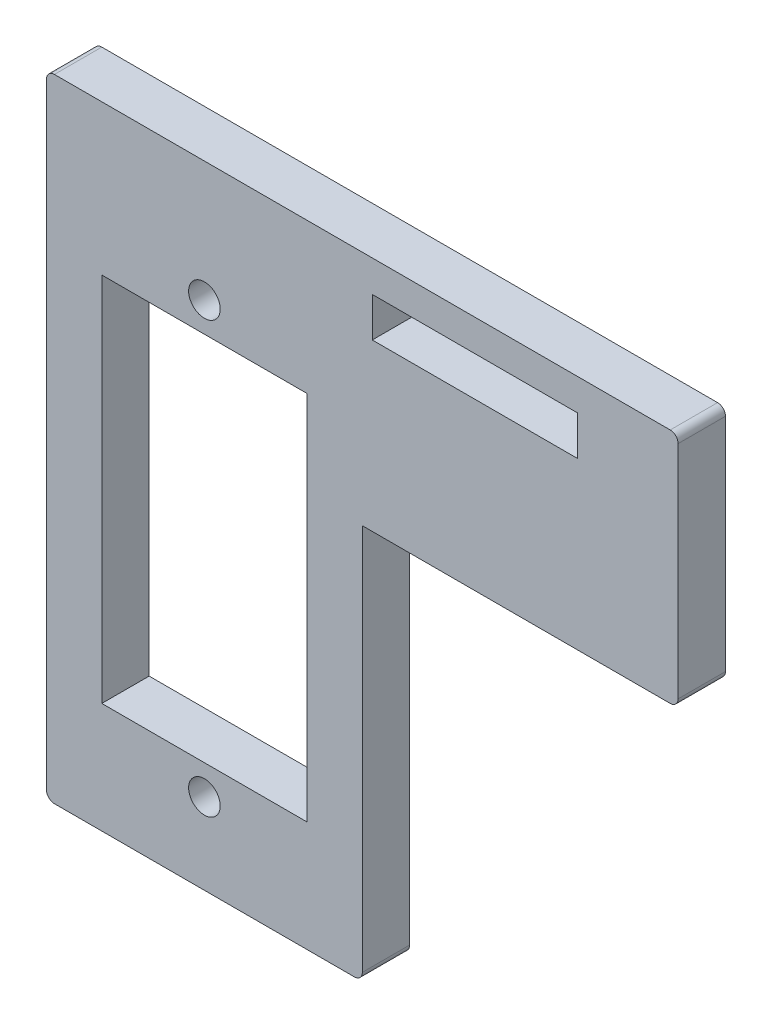
ISO-10303-21;
HEADER;
FILE_DESCRIPTION(('STEP AP214'),'2;1');
FILE_NAME('part.step','',(''),(''),'','','');
FILE_SCHEMA(('AUTOMOTIVE_DESIGN { 1 0 10303 214 1 1 1 1 }'));
ENDSEC;
DATA;
#1=APPLICATION_CONTEXT('core data for automotive mechanical design processes');
#2=APPLICATION_PROTOCOL_DEFINITION('international standard','automotive_design',2000,#1);
#3=PRODUCT_CONTEXT('',#1,'mechanical');
#4=PRODUCT('Part','Part','',(#3));
#5=PRODUCT_RELATED_PRODUCT_CATEGORY('part','',(#4));
#6=PRODUCT_DEFINITION_FORMATION('','',#4);
#7=PRODUCT_DEFINITION_CONTEXT('part definition',#1,'design');
#8=PRODUCT_DEFINITION('design','',#6,#7);
#9=PRODUCT_DEFINITION_SHAPE('','',#8);
#10=(LENGTH_UNIT() NAMED_UNIT(*) SI_UNIT(.MILLI.,.METRE.));
#11=(NAMED_UNIT(*) PLANE_ANGLE_UNIT() SI_UNIT($,.RADIAN.));
#12=(NAMED_UNIT(*) SI_UNIT($,.STERADIAN.) SOLID_ANGLE_UNIT());
#13=UNCERTAINTY_MEASURE_WITH_UNIT(LENGTH_MEASURE(1.E-05),#10,'distance_accuracy_value','');
#14=(GEOMETRIC_REPRESENTATION_CONTEXT(3) GLOBAL_UNCERTAINTY_ASSIGNED_CONTEXT((#13)) GLOBAL_UNIT_ASSIGNED_CONTEXT((#10,
#11,#12)) REPRESENTATION_CONTEXT('',''));
#15=CARTESIAN_POINT('',(0.,0.,0.));
#16=DIRECTION('',(0.,0.,1.));
#17=DIRECTION('',(1.,0.,0.));
#18=AXIS2_PLACEMENT_3D('',#15,#16,#17);
#19=CARTESIAN_POINT('',(0.,0.,3.));
#20=DIRECTION('',(0.,0.,1.));
#21=DIRECTION('',(1.,0.,0.));
#22=AXIS2_PLACEMENT_3D('',#19,#20,#21);
#23=PLANE('',#22);
#24=DIRECTION('',(0.,-1.,0.));
#25=VECTOR('',#24,1.);
#26=CARTESIAN_POINT('',(23.6302282117293,19.25,3.));
#27=LINE('',#26,#25);
#28=CARTESIAN_POINT('',(23.6302282117293,19.25,3.));
#29=VERTEX_POINT('',#28);
#30=CARTESIAN_POINT('',(23.6302282117293,16.75,3.));
#31=VERTEX_POINT('',#30);
#32=EDGE_CURVE('E173',#29,#31,#27,.T.);
#33=ORIENTED_EDGE('',*,*,#32,.T.);
#34=DIRECTION('',(-1.,0.,0.));
#35=VECTOR('',#34,1.);
#36=CARTESIAN_POINT('',(23.6302282117293,16.75,3.));
#37=LINE('',#36,#35);
#38=CARTESIAN_POINT('',(10.6302282117293,16.75,3.));
#39=VERTEX_POINT('',#38);
#40=EDGE_CURVE('E162',#31,#39,#37,.T.);
#41=ORIENTED_EDGE('',*,*,#40,.T.);
#42=DIRECTION('',(0.,1.,0.));
#43=VECTOR('',#42,1.);
#44=CARTESIAN_POINT('',(10.6302282117293,19.25,3.));
#45=LINE('',#44,#43);
#46=CARTESIAN_POINT('',(10.6302282117293,19.25,3.));
#47=VERTEX_POINT('',#46);
#48=EDGE_CURVE('E183',#39,#47,#45,.T.);
#49=ORIENTED_EDGE('',*,*,#48,.T.);
#50=DIRECTION('',(1.,0.,0.));
#51=VECTOR('',#50,1.);
#52=CARTESIAN_POINT('',(23.6302282117293,19.25,3.));
#53=LINE('',#52,#51);
#54=EDGE_CURVE('E179',#47,#29,#53,.T.);
#55=ORIENTED_EDGE('',*,*,#54,.T.);
#56=EDGE_LOOP('',(#33,#41,#49,#55));
#57=FACE_BOUND('',#56,.T.);
#58=CARTESIAN_POINT('',(0.,-13.625,3.));
#59=DIRECTION('',(0.,0.,1.));
#60=DIRECTION('',(1.,0.,0.));
#61=AXIS2_PLACEMENT_3D('',#58,#59,#60);
#62=CIRCLE('',#61,1.);
#63=CARTESIAN_POINT('',(-0.999999999999998,-13.625,3.));
#64=VERTEX_POINT('',#63);
#65=EDGE_CURVE('E169',#64,#64,#62,.F.);
#66=ORIENTED_EDGE('',*,*,#65,.T.);
#67=EDGE_LOOP('',(#66));
#68=FACE_BOUND('',#67,.T.);
#69=CARTESIAN_POINT('',(0.,13.625,3.));
#70=DIRECTION('',(0.,0.,1.));
#71=DIRECTION('',(1.,0.,0.));
#72=AXIS2_PLACEMENT_3D('',#69,#70,#71);
#73=CIRCLE('',#72,0.999999999999999);
#74=CARTESIAN_POINT('',(-1.,13.625,3.));
#75=VERTEX_POINT('',#74);
#76=EDGE_CURVE('E200',#75,#75,#73,.F.);
#77=ORIENTED_EDGE('',*,*,#76,.T.);
#78=EDGE_LOOP('',(#77));
#79=FACE_BOUND('',#78,.T.);
#80=DIRECTION('',(-1.,0.,0.));
#81=VECTOR('',#80,1.);
#82=CARTESIAN_POINT('',(10.,21.25,3.));
#83=LINE('',#82,#81);
#84=CARTESIAN_POINT('',(29.5,21.25,3.));
#85=VERTEX_POINT('',#84);
#86=CARTESIAN_POINT('',(-9.5,21.25,3.));
#87=VERTEX_POINT('',#86);
#88=EDGE_CURVE('E255',#85,#87,#83,.T.);
#89=ORIENTED_EDGE('',*,*,#88,.T.);
#90=CARTESIAN_POINT('',(-9.5,20.75,3.));
#91=DIRECTION('',(0.,0.,1.));
#92=DIRECTION('',(1.,0.,0.));
#93=AXIS2_PLACEMENT_3D('',#90,#91,#92);
#94=CIRCLE('',#93,0.5);
#95=CARTESIAN_POINT('',(-10.,20.75,3.));
#96=VERTEX_POINT('',#95);
#97=EDGE_CURVE('E304',#87,#96,#94,.T.);
#98=ORIENTED_EDGE('',*,*,#97,.T.);
#99=DIRECTION('',(0.,-1.,0.));
#100=VECTOR('',#99,1.);
#101=CARTESIAN_POINT('',(-10.,21.25,3.));
#102=LINE('',#101,#100);
#103=CARTESIAN_POINT('',(-10.,-18.25,3.));
#104=VERTEX_POINT('',#103);
#105=EDGE_CURVE('E240',#96,#104,#102,.T.);
#106=ORIENTED_EDGE('',*,*,#105,.T.);
#107=CARTESIAN_POINT('',(-9.5,-18.25,3.));
#108=DIRECTION('',(0.,0.,1.));
#109=DIRECTION('',(1.,0.,0.));
#110=AXIS2_PLACEMENT_3D('',#107,#108,#109);
#111=CIRCLE('',#110,0.5);
#112=CARTESIAN_POINT('',(-9.5,-18.75,3.));
#113=VERTEX_POINT('',#112);
#114=EDGE_CURVE('E302',#104,#113,#111,.T.);
#115=ORIENTED_EDGE('',*,*,#114,.T.);
#116=DIRECTION('',(1.,0.,0.));
#117=VECTOR('',#116,1.);
#118=CARTESIAN_POINT('',(-10.,-18.75,3.));
#119=LINE('',#118,#117);
#120=CARTESIAN_POINT('',(9.50000000000001,-18.75,3.));
#121=VERTEX_POINT('',#120);
#122=EDGE_CURVE('E243',#113,#121,#119,.T.);
#123=ORIENTED_EDGE('',*,*,#122,.T.);
#124=CARTESIAN_POINT('',(9.50000000000001,-18.25,3.));
#125=DIRECTION('',(0.,0.,1.));
#126=DIRECTION('',(1.,0.,0.));
#127=AXIS2_PLACEMENT_3D('',#124,#125,#126);
#128=CIRCLE('',#127,0.5);
#129=CARTESIAN_POINT('',(10.,-18.25,3.));
#130=VERTEX_POINT('',#129);
#131=EDGE_CURVE('E300',#121,#130,#128,.T.);
#132=ORIENTED_EDGE('',*,*,#131,.T.);
#133=DIRECTION('',(0.,1.,0.));
#134=VECTOR('',#133,1.);
#135=CARTESIAN_POINT('',(10.,6.25,3.));
#136=LINE('',#135,#134);
#137=CARTESIAN_POINT('',(10.,6.25,3.));
#138=VERTEX_POINT('',#137);
#139=EDGE_CURVE('E247',#130,#138,#136,.T.);
#140=ORIENTED_EDGE('',*,*,#139,.T.);
#141=DIRECTION('',(1.,0.,0.));
#142=VECTOR('',#141,1.);
#143=CARTESIAN_POINT('',(30.,6.25,3.));
#144=LINE('',#143,#142);
#145=CARTESIAN_POINT('',(29.5,6.25,3.));
#146=VERTEX_POINT('',#145);
#147=EDGE_CURVE('E249',#138,#146,#144,.T.);
#148=ORIENTED_EDGE('',*,*,#147,.T.);
#149=CARTESIAN_POINT('',(29.5,6.75,3.));
#150=DIRECTION('',(0.,0.,1.));
#151=DIRECTION('',(1.,0.,0.));
#152=AXIS2_PLACEMENT_3D('',#149,#150,#151);
#153=CIRCLE('',#152,0.5);
#154=CARTESIAN_POINT('',(30.,6.75,3.));
#155=VERTEX_POINT('',#154);
#156=EDGE_CURVE('E298',#146,#155,#153,.T.);
#157=ORIENTED_EDGE('',*,*,#156,.T.);
#158=DIRECTION('',(0.,1.,0.));
#159=VECTOR('',#158,1.);
#160=CARTESIAN_POINT('',(30.,21.25,3.));
#161=LINE('',#160,#159);
#162=CARTESIAN_POINT('',(30.,20.75,3.));
#163=VERTEX_POINT('',#162);
#164=EDGE_CURVE('E252',#155,#163,#161,.T.);
#165=ORIENTED_EDGE('',*,*,#164,.T.);
#166=CARTESIAN_POINT('',(29.5,20.75,3.));
#167=DIRECTION('',(0.,0.,1.));
#168=DIRECTION('',(1.,0.,0.));
#169=AXIS2_PLACEMENT_3D('',#166,#167,#168);
#170=CIRCLE('',#169,0.5);
#171=EDGE_CURVE('E296',#163,#85,#170,.T.);
#172=ORIENTED_EDGE('',*,*,#171,.T.);
#173=EDGE_LOOP('',(#89,#98,#106,#115,#123,#132,#140,#148,#157,#165,#172));
#174=FACE_BOUND('',#173,.T.);
#175=DIRECTION('',(1.,0.,0.));
#176=VECTOR('',#175,1.);
#177=CARTESIAN_POINT('',(-6.5,-11.75,3.));
#178=LINE('',#177,#176);
#179=CARTESIAN_POINT('',(-6.5,-11.75,3.));
#180=VERTEX_POINT('',#179);
#181=CARTESIAN_POINT('',(6.50000000000001,-11.75,3.));
#182=VERTEX_POINT('',#181);
#183=EDGE_CURVE('E211',#180,#182,#178,.T.);
#184=ORIENTED_EDGE('',*,*,#183,.F.);
#185=DIRECTION('',(0.,-1.,0.));
#186=VECTOR('',#185,1.);
#187=CARTESIAN_POINT('',(-6.5,11.75,3.));
#188=LINE('',#187,#186);
#189=CARTESIAN_POINT('',(-6.5,11.75,3.));
#190=VERTEX_POINT('',#189);
#191=EDGE_CURVE('E209',#190,#180,#188,.T.);
#192=ORIENTED_EDGE('',*,*,#191,.F.);
#193=DIRECTION('',(-1.,0.,0.));
#194=VECTOR('',#193,1.);
#195=CARTESIAN_POINT('',(-6.5,11.75,3.));
#196=LINE('',#195,#194);
#197=CARTESIAN_POINT('',(6.5,11.75,3.));
#198=VERTEX_POINT('',#197);
#199=EDGE_CURVE('E217',#198,#190,#196,.T.);
#200=ORIENTED_EDGE('',*,*,#199,.F.);
#201=DIRECTION('',(0.,1.,0.));
#202=VECTOR('',#201,1.);
#203=CARTESIAN_POINT('',(6.5,11.75,3.));
#204=LINE('',#203,#202);
#205=EDGE_CURVE('E214',#182,#198,#204,.T.);
#206=ORIENTED_EDGE('',*,*,#205,.F.);
#207=EDGE_LOOP('',(#184,#192,#200,#206));
#208=FACE_BOUND('',#207,.T.);
#209=ADVANCED_FACE('F33',(#57,#68,#79,#174,#208),#23,.T.);
#210=CARTESIAN_POINT('',(0.,0.,0.));
#211=DIRECTION('',(0.,0.,1.));
#212=DIRECTION('',(1.,0.,0.));
#213=AXIS2_PLACEMENT_3D('',#210,#211,#212);
#214=PLANE('',#213);
#215=DIRECTION('',(-1.,0.,0.));
#216=VECTOR('',#215,1.);
#217=CARTESIAN_POINT('',(23.6302282117293,16.75,0.));
#218=LINE('',#217,#216);
#219=CARTESIAN_POINT('',(23.6302282117293,16.75,0.));
#220=VERTEX_POINT('',#219);
#221=CARTESIAN_POINT('',(10.6302282117293,16.75,0.));
#222=VERTEX_POINT('',#221);
#223=EDGE_CURVE('E181',#220,#222,#218,.T.);
#224=ORIENTED_EDGE('',*,*,#223,.F.);
#225=DIRECTION('',(0.,-1.,0.));
#226=VECTOR('',#225,1.);
#227=CARTESIAN_POINT('',(23.6302282117293,19.25,0.));
#228=LINE('',#227,#226);
#229=CARTESIAN_POINT('',(23.6302282117293,19.25,0.));
#230=VERTEX_POINT('',#229);
#231=EDGE_CURVE('E56',#230,#220,#228,.T.);
#232=ORIENTED_EDGE('',*,*,#231,.F.);
#233=DIRECTION('',(1.,0.,0.));
#234=VECTOR('',#233,1.);
#235=CARTESIAN_POINT('',(23.6302282117293,19.25,0.));
#236=LINE('',#235,#234);
#237=CARTESIAN_POINT('',(10.6302282117293,19.25,0.));
#238=VERTEX_POINT('',#237);
#239=EDGE_CURVE('E175',#238,#230,#236,.T.);
#240=ORIENTED_EDGE('',*,*,#239,.F.);
#241=DIRECTION('',(0.,1.,0.));
#242=VECTOR('',#241,1.);
#243=CARTESIAN_POINT('',(10.6302282117293,19.25,0.));
#244=LINE('',#243,#242);
#245=EDGE_CURVE('E188',#222,#238,#244,.T.);
#246=ORIENTED_EDGE('',*,*,#245,.F.);
#247=EDGE_LOOP('',(#224,#232,#240,#246));
#248=FACE_BOUND('',#247,.T.);
#249=CARTESIAN_POINT('',(0.,-13.625,0.));
#250=DIRECTION('',(0.,0.,-1.));
#251=DIRECTION('',(-1.,0.,0.));
#252=AXIS2_PLACEMENT_3D('',#249,#250,#251);
#253=CIRCLE('',#252,1.);
#254=CARTESIAN_POINT('',(-0.999999999999998,-13.625,0.));
#255=VERTEX_POINT('',#254);
#256=EDGE_CURVE('E197',#255,#255,#253,.T.);
#257=ORIENTED_EDGE('',*,*,#256,.F.);
#258=EDGE_LOOP('',(#257));
#259=FACE_BOUND('',#258,.T.);
#260=CARTESIAN_POINT('',(0.,13.625,0.));
#261=DIRECTION('',(0.,0.,-1.));
#262=DIRECTION('',(-1.,0.,0.));
#263=AXIS2_PLACEMENT_3D('',#260,#261,#262);
#264=CIRCLE('',#263,0.999999999999999);
#265=CARTESIAN_POINT('',(-1.,13.625,0.));
#266=VERTEX_POINT('',#265);
#267=EDGE_CURVE('E203',#266,#266,#264,.T.);
#268=ORIENTED_EDGE('',*,*,#267,.F.);
#269=EDGE_LOOP('',(#268));
#270=FACE_BOUND('',#269,.T.);
#271=DIRECTION('',(0.,-1.,0.));
#272=VECTOR('',#271,1.);
#273=CARTESIAN_POINT('',(-10.,21.25,0.));
#274=LINE('',#273,#272);
#275=CARTESIAN_POINT('',(-10.,20.75,0.));
#276=VERTEX_POINT('',#275);
#277=CARTESIAN_POINT('',(-10.,-18.25,0.));
#278=VERTEX_POINT('',#277);
#279=EDGE_CURVE('E239',#276,#278,#274,.T.);
#280=ORIENTED_EDGE('',*,*,#279,.F.);
#281=CARTESIAN_POINT('',(-9.5,20.75,0.));
#282=DIRECTION('',(0.,0.,1.));
#283=DIRECTION('',(1.,0.,0.));
#284=AXIS2_PLACEMENT_3D('',#281,#282,#283);
#285=CIRCLE('',#284,0.5);
#286=CARTESIAN_POINT('',(-9.5,21.25,0.));
#287=VERTEX_POINT('',#286);
#288=EDGE_CURVE('E289',#276,#287,#285,.F.);
#289=ORIENTED_EDGE('',*,*,#288,.T.);
#290=DIRECTION('',(-1.,0.,0.));
#291=VECTOR('',#290,1.);
#292=CARTESIAN_POINT('',(-10.,21.25,0.));
#293=LINE('',#292,#291);
#294=CARTESIAN_POINT('',(29.5,21.25,0.));
#295=VERTEX_POINT('',#294);
#296=EDGE_CURVE('E244',#295,#287,#293,.T.);
#297=ORIENTED_EDGE('',*,*,#296,.F.);
#298=CARTESIAN_POINT('',(29.5,20.75,0.));
#299=DIRECTION('',(0.,0.,1.));
#300=DIRECTION('',(1.,0.,0.));
#301=AXIS2_PLACEMENT_3D('',#298,#299,#300);
#302=CIRCLE('',#301,0.5);
#303=CARTESIAN_POINT('',(30.,20.75,0.));
#304=VERTEX_POINT('',#303);
#305=EDGE_CURVE('E281',#295,#304,#302,.F.);
#306=ORIENTED_EDGE('',*,*,#305,.T.);
#307=DIRECTION('',(0.,1.,0.));
#308=VECTOR('',#307,1.);
#309=CARTESIAN_POINT('',(30.,21.25,0.));
#310=LINE('',#309,#308);
#311=CARTESIAN_POINT('',(30.,6.75,0.));
#312=VERTEX_POINT('',#311);
#313=EDGE_CURVE('E269',#312,#304,#310,.T.);
#314=ORIENTED_EDGE('',*,*,#313,.F.);
#315=CARTESIAN_POINT('',(29.5,6.75,0.));
#316=DIRECTION('',(0.,0.,1.));
#317=DIRECTION('',(1.,0.,0.));
#318=AXIS2_PLACEMENT_3D('',#315,#316,#317);
#319=CIRCLE('',#318,0.5);
#320=CARTESIAN_POINT('',(29.5,6.25,0.));
#321=VERTEX_POINT('',#320);
#322=EDGE_CURVE('E283',#312,#321,#319,.F.);
#323=ORIENTED_EDGE('',*,*,#322,.T.);
#324=DIRECTION('',(1.,0.,0.));
#325=VECTOR('',#324,1.);
#326=CARTESIAN_POINT('',(30.,6.25,0.));
#327=LINE('',#326,#325);
#328=CARTESIAN_POINT('',(10.,6.25,0.));
#329=VERTEX_POINT('',#328);
#330=EDGE_CURVE('E266',#329,#321,#327,.T.);
#331=ORIENTED_EDGE('',*,*,#330,.F.);
#332=DIRECTION('',(0.,1.,0.));
#333=VECTOR('',#332,1.);
#334=CARTESIAN_POINT('',(10.,6.25,0.));
#335=LINE('',#334,#333);
#336=CARTESIAN_POINT('',(10.,-18.25,0.));
#337=VERTEX_POINT('',#336);
#338=EDGE_CURVE('E264',#337,#329,#335,.T.);
#339=ORIENTED_EDGE('',*,*,#338,.F.);
#340=CARTESIAN_POINT('',(9.50000000000001,-18.25,0.));
#341=DIRECTION('',(0.,0.,1.));
#342=DIRECTION('',(1.,0.,0.));
#343=AXIS2_PLACEMENT_3D('',#340,#341,#342);
#344=CIRCLE('',#343,0.5);
#345=CARTESIAN_POINT('',(9.50000000000001,-18.75,0.));
#346=VERTEX_POINT('',#345);
#347=EDGE_CURVE('E285',#337,#346,#344,.F.);
#348=ORIENTED_EDGE('',*,*,#347,.T.);
#349=DIRECTION('',(1.,0.,0.));
#350=VECTOR('',#349,1.);
#351=CARTESIAN_POINT('',(-10.,-18.75,0.));
#352=LINE('',#351,#350);
#353=CARTESIAN_POINT('',(-9.5,-18.75,0.));
#354=VERTEX_POINT('',#353);
#355=EDGE_CURVE('E261',#354,#346,#352,.T.);
#356=ORIENTED_EDGE('',*,*,#355,.F.);
#357=CARTESIAN_POINT('',(-9.5,-18.25,0.));
#358=DIRECTION('',(0.,0.,1.));
#359=DIRECTION('',(1.,0.,0.));
#360=AXIS2_PLACEMENT_3D('',#357,#358,#359);
#361=CIRCLE('',#360,0.5);
#362=EDGE_CURVE('E287',#354,#278,#361,.F.);
#363=ORIENTED_EDGE('',*,*,#362,.T.);
#364=EDGE_LOOP('',(#280,#289,#297,#306,#314,#323,#331,#339,#348,#356,#363));
#365=FACE_BOUND('',#364,.T.);
#366=DIRECTION('',(0.,-1.,0.));
#367=VECTOR('',#366,1.);
#368=CARTESIAN_POINT('',(-6.5,11.75,0.));
#369=LINE('',#368,#367);
#370=CARTESIAN_POINT('',(-6.5,11.75,0.));
#371=VERTEX_POINT('',#370);
#372=CARTESIAN_POINT('',(-6.5,-11.75,0.));
#373=VERTEX_POINT('',#372);
#374=EDGE_CURVE('E206',#371,#373,#369,.T.);
#375=ORIENTED_EDGE('',*,*,#374,.T.);
#376=DIRECTION('',(1.,0.,0.));
#377=VECTOR('',#376,1.);
#378=CARTESIAN_POINT('',(-6.5,-11.75,0.));
#379=LINE('',#378,#377);
#380=CARTESIAN_POINT('',(6.50000000000001,-11.75,0.));
#381=VERTEX_POINT('',#380);
#382=EDGE_CURVE('E222',#373,#381,#379,.T.);
#383=ORIENTED_EDGE('',*,*,#382,.T.);
#384=DIRECTION('',(0.,1.,0.));
#385=VECTOR('',#384,1.);
#386=CARTESIAN_POINT('',(6.5,11.75,0.));
#387=LINE('',#386,#385);
#388=CARTESIAN_POINT('',(6.5,11.75,0.));
#389=VERTEX_POINT('',#388);
#390=EDGE_CURVE('E225',#381,#389,#387,.T.);
#391=ORIENTED_EDGE('',*,*,#390,.T.);
#392=DIRECTION('',(-1.,0.,0.));
#393=VECTOR('',#392,1.);
#394=CARTESIAN_POINT('',(-6.5,11.75,0.));
#395=LINE('',#394,#393);
#396=EDGE_CURVE('E212',#389,#371,#395,.T.);
#397=ORIENTED_EDGE('',*,*,#396,.T.);
#398=EDGE_LOOP('',(#375,#383,#391,#397));
#399=FACE_BOUND('',#398,.T.);
#400=ADVANCED_FACE('F326',(#248,#259,#270,#365,#399),#214,.F.);
#401=CARTESIAN_POINT('',(-10.,21.25,3.));
#402=DIRECTION('',(1.,0.,0.));
#403=DIRECTION('',(0.,1.,0.));
#404=AXIS2_PLACEMENT_3D('',#401,#402,#403);
#405=PLANE('',#404);
#406=ORIENTED_EDGE('',*,*,#105,.F.);
#407=DIRECTION('',(0.,0.,-1.));
#408=VECTOR('',#407,1.);
#409=CARTESIAN_POINT('',(-10.,20.75,3.));
#410=LINE('',#409,#408);
#411=EDGE_CURVE('E278',#96,#276,#410,.T.);
#412=ORIENTED_EDGE('',*,*,#411,.T.);
#413=ORIENTED_EDGE('',*,*,#279,.T.);
#414=DIRECTION('',(0.,0.,-1.));
#415=VECTOR('',#414,1.);
#416=CARTESIAN_POINT('',(-10.,-18.25,3.));
#417=LINE('',#416,#415);
#418=EDGE_CURVE('E276',#278,#104,#417,.F.);
#419=ORIENTED_EDGE('',*,*,#418,.T.);
#420=EDGE_LOOP('',(#406,#412,#413,#419));
#421=FACE_BOUND('',#420,.T.);
#422=ADVANCED_FACE('F345',(#421),#405,.F.);
#423=CARTESIAN_POINT('',(-10.,-18.75,3.));
#424=DIRECTION('',(0.,1.,0.));
#425=DIRECTION('',(-1.,0.,0.));
#426=AXIS2_PLACEMENT_3D('',#423,#424,#425);
#427=PLANE('',#426);
#428=ORIENTED_EDGE('',*,*,#122,.F.);
#429=DIRECTION('',(0.,0.,-1.));
#430=VECTOR('',#429,1.);
#431=CARTESIAN_POINT('',(-9.5,-18.75,3.));
#432=LINE('',#431,#430);
#433=EDGE_CURVE('E308',#113,#354,#432,.T.);
#434=ORIENTED_EDGE('',*,*,#433,.T.);
#435=ORIENTED_EDGE('',*,*,#355,.T.);
#436=DIRECTION('',(0.,0.,-1.));
#437=VECTOR('',#436,1.);
#438=CARTESIAN_POINT('',(9.50000000000001,-18.75,3.));
#439=LINE('',#438,#437);
#440=EDGE_CURVE('E306',#346,#121,#439,.F.);
#441=ORIENTED_EDGE('',*,*,#440,.T.);
#442=EDGE_LOOP('',(#428,#434,#435,#441));
#443=FACE_BOUND('',#442,.T.);
#444=ADVANCED_FACE('F354',(#443),#427,.F.);
#445=CARTESIAN_POINT('',(10.,6.25,3.));
#446=DIRECTION('',(-1.,0.,0.));
#447=DIRECTION('',(0.,-1.,0.));
#448=AXIS2_PLACEMENT_3D('',#445,#446,#447);
#449=PLANE('',#448);
#450=ORIENTED_EDGE('',*,*,#139,.F.);
#451=DIRECTION('',(0.,0.,-1.));
#452=VECTOR('',#451,1.);
#453=CARTESIAN_POINT('',(10.,-18.25,3.));
#454=LINE('',#453,#452);
#455=EDGE_CURVE('E311',#130,#337,#454,.T.);
#456=ORIENTED_EDGE('',*,*,#455,.T.);
#457=ORIENTED_EDGE('',*,*,#338,.T.);
#458=DIRECTION('',(0.,0.,-1.));
#459=VECTOR('',#458,1.);
#460=CARTESIAN_POINT('',(10.,6.25,3.));
#461=LINE('',#460,#459);
#462=EDGE_CURVE('E258',#138,#329,#461,.T.);
#463=ORIENTED_EDGE('',*,*,#462,.F.);
#464=EDGE_LOOP('',(#450,#456,#457,#463));
#465=FACE_BOUND('',#464,.T.);
#466=ADVANCED_FACE('F363',(#465),#449,.F.);
#467=CARTESIAN_POINT('',(30.,6.25,3.));
#468=DIRECTION('',(0.,1.,0.));
#469=DIRECTION('',(-1.,0.,0.));
#470=AXIS2_PLACEMENT_3D('',#467,#468,#469);
#471=PLANE('',#470);
#472=ORIENTED_EDGE('',*,*,#330,.T.);
#473=DIRECTION('',(0.,0.,-1.));
#474=VECTOR('',#473,1.);
#475=CARTESIAN_POINT('',(29.5,6.25,3.));
#476=LINE('',#475,#474);
#477=EDGE_CURVE('E11',#321,#146,#476,.F.);
#478=ORIENTED_EDGE('',*,*,#477,.T.);
#479=ORIENTED_EDGE('',*,*,#147,.F.);
#480=ORIENTED_EDGE('',*,*,#462,.T.);
#481=EDGE_LOOP('',(#472,#478,#479,#480));
#482=FACE_BOUND('',#481,.T.);
#483=ADVANCED_FACE('F367',(#482),#471,.F.);
#484=CARTESIAN_POINT('',(30.,21.25,3.));
#485=DIRECTION('',(-1.,0.,0.));
#486=DIRECTION('',(0.,-1.,0.));
#487=AXIS2_PLACEMENT_3D('',#484,#485,#486);
#488=PLANE('',#487);
#489=ORIENTED_EDGE('',*,*,#164,.F.);
#490=DIRECTION('',(0.,0.,-1.));
#491=VECTOR('',#490,1.);
#492=CARTESIAN_POINT('',(30.,6.75,3.));
#493=LINE('',#492,#491);
#494=EDGE_CURVE('E41',#155,#312,#493,.T.);
#495=ORIENTED_EDGE('',*,*,#494,.T.);
#496=ORIENTED_EDGE('',*,*,#313,.T.);
#497=DIRECTION('',(0.,0.,-1.));
#498=VECTOR('',#497,1.);
#499=CARTESIAN_POINT('',(30.,20.75,3.));
#500=LINE('',#499,#498);
#501=EDGE_CURVE('E314',#304,#163,#500,.F.);
#502=ORIENTED_EDGE('',*,*,#501,.T.);
#503=EDGE_LOOP('',(#489,#495,#496,#502));
#504=FACE_BOUND('',#503,.T.);
#505=ADVANCED_FACE('F320',(#504),#488,.F.);
#506=CARTESIAN_POINT('',(-10.,21.25,3.));
#507=DIRECTION('',(0.,-1.,0.));
#508=DIRECTION('',(0.,0.,-1.));
#509=AXIS2_PLACEMENT_3D('',#506,#507,#508);
#510=PLANE('',#509);
#511=ORIENTED_EDGE('',*,*,#296,.T.);
#512=DIRECTION('',(0.,0.,-1.));
#513=VECTOR('',#512,1.);
#514=CARTESIAN_POINT('',(-9.5,21.25,3.));
#515=LINE('',#514,#513);
#516=EDGE_CURVE('E294',#287,#87,#515,.F.);
#517=ORIENTED_EDGE('',*,*,#516,.T.);
#518=ORIENTED_EDGE('',*,*,#88,.F.);
#519=DIRECTION('',(0.,0.,-1.));
#520=VECTOR('',#519,1.);
#521=CARTESIAN_POINT('',(29.5,21.25,3.));
#522=LINE('',#521,#520);
#523=EDGE_CURVE('E291',#85,#295,#522,.T.);
#524=ORIENTED_EDGE('',*,*,#523,.T.);
#525=EDGE_LOOP('',(#511,#517,#518,#524));
#526=FACE_BOUND('',#525,.T.);
#527=ADVANCED_FACE('F335',(#526),#510,.F.);
#528=CARTESIAN_POINT('',(-6.5,11.75,3.));
#529=DIRECTION('',(1.,0.,0.));
#530=DIRECTION('',(0.,1.,0.));
#531=AXIS2_PLACEMENT_3D('',#528,#529,#530);
#532=PLANE('',#531);
#533=ORIENTED_EDGE('',*,*,#374,.F.);
#534=DIRECTION('',(0.,0.,-1.));
#535=VECTOR('',#534,1.);
#536=CARTESIAN_POINT('',(-6.5,11.75,3.));
#537=LINE('',#536,#535);
#538=EDGE_CURVE('E219',#190,#371,#537,.T.);
#539=ORIENTED_EDGE('',*,*,#538,.F.);
#540=ORIENTED_EDGE('',*,*,#191,.T.);
#541=DIRECTION('',(0.,0.,-1.));
#542=VECTOR('',#541,1.);
#543=CARTESIAN_POINT('',(-6.5,-11.75,3.));
#544=LINE('',#543,#542);
#545=EDGE_CURVE('E236',#180,#373,#544,.T.);
#546=ORIENTED_EDGE('',*,*,#545,.T.);
#547=EDGE_LOOP('',(#533,#539,#540,#546));
#548=FACE_BOUND('',#547,.T.);
#549=ADVANCED_FACE('F385',(#548),#532,.T.);
#550=CARTESIAN_POINT('',(-6.5,-11.75,3.));
#551=DIRECTION('',(0.,1.,0.));
#552=DIRECTION('',(-1.,0.,0.));
#553=AXIS2_PLACEMENT_3D('',#550,#551,#552);
#554=PLANE('',#553);
#555=ORIENTED_EDGE('',*,*,#382,.F.);
#556=ORIENTED_EDGE('',*,*,#545,.F.);
#557=ORIENTED_EDGE('',*,*,#183,.T.);
#558=DIRECTION('',(0.,0.,-1.));
#559=VECTOR('',#558,1.);
#560=CARTESIAN_POINT('',(6.50000000000001,-11.75,3.));
#561=LINE('',#560,#559);
#562=EDGE_CURVE('E234',#182,#381,#561,.T.);
#563=ORIENTED_EDGE('',*,*,#562,.T.);
#564=EDGE_LOOP('',(#555,#556,#557,#563));
#565=FACE_BOUND('',#564,.T.);
#566=ADVANCED_FACE('F498',(#565),#554,.T.);
#567=CARTESIAN_POINT('',(6.5,11.75,3.));
#568=DIRECTION('',(-1.,0.,0.));
#569=DIRECTION('',(0.,-1.,0.));
#570=AXIS2_PLACEMENT_3D('',#567,#568,#569);
#571=PLANE('',#570);
#572=ORIENTED_EDGE('',*,*,#390,.F.);
#573=ORIENTED_EDGE('',*,*,#562,.F.);
#574=ORIENTED_EDGE('',*,*,#205,.T.);
#575=DIRECTION('',(0.,0.,-1.));
#576=VECTOR('',#575,1.);
#577=CARTESIAN_POINT('',(6.5,11.75,3.));
#578=LINE('',#577,#576);
#579=EDGE_CURVE('E232',#198,#389,#578,.T.);
#580=ORIENTED_EDGE('',*,*,#579,.T.);
#581=EDGE_LOOP('',(#572,#573,#574,#580));
#582=FACE_BOUND('',#581,.T.);
#583=ADVANCED_FACE('F495',(#582),#571,.T.);
#584=CARTESIAN_POINT('',(-6.5,11.75,3.));
#585=DIRECTION('',(0.,-1.,0.));
#586=DIRECTION('',(0.,0.,-1.));
#587=AXIS2_PLACEMENT_3D('',#584,#585,#586);
#588=PLANE('',#587);
#589=ORIENTED_EDGE('',*,*,#396,.F.);
#590=ORIENTED_EDGE('',*,*,#579,.F.);
#591=ORIENTED_EDGE('',*,*,#199,.T.);
#592=ORIENTED_EDGE('',*,*,#538,.T.);
#593=EDGE_LOOP('',(#589,#590,#591,#592));
#594=FACE_BOUND('',#593,.T.);
#595=ADVANCED_FACE('F402',(#594),#588,.T.);
#596=CARTESIAN_POINT('',(-9.5,20.75,3.));
#597=DIRECTION('',(0.,0.,-1.));
#598=DIRECTION('',(-1.,0.,0.));
#599=AXIS2_PLACEMENT_3D('',#596,#597,#598);
#600=CYLINDRICAL_SURFACE('',#599,0.5);
#601=ORIENTED_EDGE('',*,*,#97,.F.);
#602=ORIENTED_EDGE('',*,*,#516,.F.);
#603=ORIENTED_EDGE('',*,*,#288,.F.);
#604=ORIENTED_EDGE('',*,*,#411,.F.);
#605=EDGE_LOOP('',(#601,#602,#603,#604));
#606=FACE_BOUND('',#605,.T.);
#607=ADVANCED_FACE('F343',(#606),#600,.T.);
#608=CARTESIAN_POINT('',(-9.5,-18.25,3.));
#609=DIRECTION('',(0.,0.,-1.));
#610=DIRECTION('',(-1.,0.,0.));
#611=AXIS2_PLACEMENT_3D('',#608,#609,#610);
#612=CYLINDRICAL_SURFACE('',#611,0.5);
#613=ORIENTED_EDGE('',*,*,#114,.F.);
#614=ORIENTED_EDGE('',*,*,#418,.F.);
#615=ORIENTED_EDGE('',*,*,#362,.F.);
#616=ORIENTED_EDGE('',*,*,#433,.F.);
#617=EDGE_LOOP('',(#613,#614,#615,#616));
#618=FACE_BOUND('',#617,.T.);
#619=ADVANCED_FACE('F351',(#618),#612,.T.);
#620=CARTESIAN_POINT('',(9.50000000000001,-18.25,3.));
#621=DIRECTION('',(0.,0.,-1.));
#622=DIRECTION('',(-1.,0.,0.));
#623=AXIS2_PLACEMENT_3D('',#620,#621,#622);
#624=CYLINDRICAL_SURFACE('',#623,0.5);
#625=ORIENTED_EDGE('',*,*,#131,.F.);
#626=ORIENTED_EDGE('',*,*,#440,.F.);
#627=ORIENTED_EDGE('',*,*,#347,.F.);
#628=ORIENTED_EDGE('',*,*,#455,.F.);
#629=EDGE_LOOP('',(#625,#626,#627,#628));
#630=FACE_BOUND('',#629,.T.);
#631=ADVANCED_FACE('F360',(#630),#624,.T.);
#632=CARTESIAN_POINT('',(29.5,6.75,3.));
#633=DIRECTION('',(0.,0.,-1.));
#634=DIRECTION('',(-1.,0.,0.));
#635=AXIS2_PLACEMENT_3D('',#632,#633,#634);
#636=CYLINDRICAL_SURFACE('',#635,0.5);
#637=ORIENTED_EDGE('',*,*,#156,.F.);
#638=ORIENTED_EDGE('',*,*,#477,.F.);
#639=ORIENTED_EDGE('',*,*,#322,.F.);
#640=ORIENTED_EDGE('',*,*,#494,.F.);
#641=EDGE_LOOP('',(#637,#638,#639,#640));
#642=FACE_BOUND('',#641,.T.);
#643=ADVANCED_FACE('F369',(#642),#636,.T.);
#644=CARTESIAN_POINT('',(29.5,20.75,3.));
#645=DIRECTION('',(0.,0.,-1.));
#646=DIRECTION('',(-1.,0.,0.));
#647=AXIS2_PLACEMENT_3D('',#644,#645,#646);
#648=CYLINDRICAL_SURFACE('',#647,0.5);
#649=ORIENTED_EDGE('',*,*,#171,.F.);
#650=ORIENTED_EDGE('',*,*,#501,.F.);
#651=ORIENTED_EDGE('',*,*,#305,.F.);
#652=ORIENTED_EDGE('',*,*,#523,.F.);
#653=EDGE_LOOP('',(#649,#650,#651,#652));
#654=FACE_BOUND('',#653,.T.);
#655=ADVANCED_FACE('F35',(#654),#648,.T.);
#656=CARTESIAN_POINT('',(0.,13.625,3.001));
#657=DIRECTION('',(0.,0.,-1.));
#658=DIRECTION('',(-1.,0.,0.));
#659=AXIS2_PLACEMENT_3D('',#656,#657,#658);
#660=CYLINDRICAL_SURFACE('',#659,0.999999999999999);
#661=CARTESIAN_POINT('',(-1.,13.625,3.));
#662=CARTESIAN_POINT('',(-1.,13.625,2.96875));
#663=CARTESIAN_POINT('',(-1.,13.625,2.9375));
#664=CARTESIAN_POINT('',(-1.,13.625,2.875));
#665=CARTESIAN_POINT('',(-1.,13.625,2.84375));
#666=CARTESIAN_POINT('',(-1.,13.625,2.78125));
#667=CARTESIAN_POINT('',(-1.,13.625,2.75));
#668=CARTESIAN_POINT('',(-1.,13.625,2.6875));
#669=CARTESIAN_POINT('',(-1.,13.625,2.65625));
#670=CARTESIAN_POINT('',(-1.,13.625,2.59375));
#671=CARTESIAN_POINT('',(-1.,13.625,2.5625));
#672=CARTESIAN_POINT('',(-1.,13.625,2.5));
#673=CARTESIAN_POINT('',(-1.,13.625,2.46875));
#674=CARTESIAN_POINT('',(-1.,13.625,2.40625));
#675=CARTESIAN_POINT('',(-1.,13.625,2.375));
#676=CARTESIAN_POINT('',(-1.,13.625,2.3125));
#677=CARTESIAN_POINT('',(-1.,13.625,2.28125));
#678=CARTESIAN_POINT('',(-1.,13.625,2.21875));
#679=CARTESIAN_POINT('',(-1.,13.625,2.1875));
#680=CARTESIAN_POINT('',(-1.,13.625,2.125));
#681=CARTESIAN_POINT('',(-1.,13.625,2.09375));
#682=CARTESIAN_POINT('',(-1.,13.625,2.03125));
#683=CARTESIAN_POINT('',(-1.,13.625,2.));
#684=CARTESIAN_POINT('',(-1.,13.625,1.9375));
#685=CARTESIAN_POINT('',(-1.,13.625,1.90625));
#686=CARTESIAN_POINT('',(-1.,13.625,1.84375));
#687=CARTESIAN_POINT('',(-1.,13.625,1.8125));
#688=CARTESIAN_POINT('',(-1.,13.625,1.75));
#689=CARTESIAN_POINT('',(-1.,13.625,1.71875));
#690=CARTESIAN_POINT('',(-1.,13.625,1.65625));
#691=CARTESIAN_POINT('',(-1.,13.625,1.625));
#692=CARTESIAN_POINT('',(-1.,13.625,1.5625));
#693=CARTESIAN_POINT('',(-1.,13.625,1.53125));
#694=CARTESIAN_POINT('',(-1.,13.625,1.46875));
#695=CARTESIAN_POINT('',(-1.,13.625,1.4375));
#696=CARTESIAN_POINT('',(-1.,13.625,1.375));
#697=CARTESIAN_POINT('',(-1.,13.625,1.34375));
#698=CARTESIAN_POINT('',(-1.,13.625,1.28125));
#699=CARTESIAN_POINT('',(-1.,13.625,1.25));
#700=CARTESIAN_POINT('',(-1.,13.625,1.1875));
#701=CARTESIAN_POINT('',(-1.,13.625,1.15625));
#702=CARTESIAN_POINT('',(-1.,13.625,1.09375));
#703=CARTESIAN_POINT('',(-1.,13.625,1.0625));
#704=CARTESIAN_POINT('',(-1.,13.625,1.));
#705=CARTESIAN_POINT('',(-1.,13.625,0.96875));
#706=CARTESIAN_POINT('',(-1.,13.625,0.90625));
#707=CARTESIAN_POINT('',(-1.,13.625,0.875));
#708=CARTESIAN_POINT('',(-1.,13.625,0.8125));
#709=CARTESIAN_POINT('',(-1.,13.625,0.78125));
#710=CARTESIAN_POINT('',(-1.,13.625,0.71875));
#711=CARTESIAN_POINT('',(-1.,13.625,0.6875));
#712=CARTESIAN_POINT('',(-1.,13.625,0.625));
#713=CARTESIAN_POINT('',(-1.,13.625,0.59375));
#714=CARTESIAN_POINT('',(-1.,13.625,0.53125));
#715=CARTESIAN_POINT('',(-1.,13.625,0.5));
#716=CARTESIAN_POINT('',(-1.,13.625,0.4375));
#717=CARTESIAN_POINT('',(-1.,13.625,0.40625));
#718=CARTESIAN_POINT('',(-1.,13.625,0.34375));
#719=CARTESIAN_POINT('',(-1.,13.625,0.3125));
#720=CARTESIAN_POINT('',(-1.,13.625,0.25));
#721=CARTESIAN_POINT('',(-1.,13.625,0.21875));
#722=CARTESIAN_POINT('',(-1.,13.625,0.156250000000001));
#723=CARTESIAN_POINT('',(-1.,13.625,0.125000000000001));
#724=CARTESIAN_POINT('',(-1.,13.625,0.0625000000000005));
#725=CARTESIAN_POINT('',(-1.,13.625,0.0312500000000005));
#726=CARTESIAN_POINT('',(-1.,13.625,0.));
#727=B_SPLINE_CURVE_WITH_KNOTS('',3,(#661,#662,#663,#664,#665,#666,#667,#668,#669,#670,#671,
#672,#673,#674,#675,#676,#677,#678,#679,#680,#681,#682,#683,#684,#685,#686,#687,#688,#689,#690,
#691,#692,#693,#694,#695,#696,#697,#698,#699,#700,#701,#702,#703,#704,#705,#706,#707,#708,#709,
#710,#711,#712,#713,#714,#715,#716,#717,#718,#719,#720,#721,#722,#723,#724,#725,#726),
.UNSPECIFIED.,.F.,.F.,(4,2,2,2,2,2,2,2,2,2,2,2,2,2,2,2,2,2,2,2,2,2,2,2,2,2,2,2,2,2,2,2,4),(0.,
0.0937499999999997,0.1875,0.28125,0.375,0.46875,0.5625,0.65625,0.749999999999999,
0.843749999999999,0.9375,1.03125,1.125,1.21875,1.3125,1.40625,1.5,1.59375,1.6875,1.78125,1.875,
1.96875,2.0625,2.15625,2.25,2.34375,2.4375,2.53125,2.625,2.71875,2.8125,2.90625,3.),.UNSPECIFIED.);
#728=EDGE_CURVE('BSEAM375',#75,#266,#727,.T.);
#729=ORIENTED_EDGE('',*,*,#76,.F.);
#730=ORIENTED_EDGE('',*,*,#267,.T.);
#731=ORIENTED_EDGE('',*,*,#728,.T.);
#732=ORIENTED_EDGE('',*,*,#728,.F.);
#733=EDGE_LOOP('',(#729,#731,#730,#732));
#734=FACE_BOUND('',#733,.T.);
#735=ADVANCED_FACE('F375',(#734),#660,.F.);
#736=CARTESIAN_POINT('',(0.,-13.625,3.001));
#737=DIRECTION('',(0.,0.,-1.));
#738=DIRECTION('',(-1.,0.,0.));
#739=AXIS2_PLACEMENT_3D('',#736,#737,#738);
#740=CYLINDRICAL_SURFACE('',#739,1.);
#741=CARTESIAN_POINT('',(-0.999999999999998,-13.625,3.));
#742=CARTESIAN_POINT('',(-0.999999999999998,-13.625,2.96875));
#743=CARTESIAN_POINT('',(-0.999999999999998,-13.625,2.9375));
#744=CARTESIAN_POINT('',(-0.999999999999998,-13.625,2.875));
#745=CARTESIAN_POINT('',(-0.999999999999998,-13.625,2.84375));
#746=CARTESIAN_POINT('',(-0.999999999999998,-13.625,2.78125));
#747=CARTESIAN_POINT('',(-0.999999999999998,-13.625,2.75));
#748=CARTESIAN_POINT('',(-0.999999999999998,-13.625,2.6875));
#749=CARTESIAN_POINT('',(-0.999999999999998,-13.625,2.65625));
#750=CARTESIAN_POINT('',(-0.999999999999998,-13.625,2.59375));
#751=CARTESIAN_POINT('',(-0.999999999999998,-13.625,2.5625));
#752=CARTESIAN_POINT('',(-0.999999999999998,-13.625,2.5));
#753=CARTESIAN_POINT('',(-0.999999999999998,-13.625,2.46875));
#754=CARTESIAN_POINT('',(-0.999999999999998,-13.625,2.40625));
#755=CARTESIAN_POINT('',(-0.999999999999998,-13.625,2.375));
#756=CARTESIAN_POINT('',(-0.999999999999998,-13.625,2.3125));
#757=CARTESIAN_POINT('',(-0.999999999999998,-13.625,2.28125));
#758=CARTESIAN_POINT('',(-0.999999999999998,-13.625,2.21875));
#759=CARTESIAN_POINT('',(-0.999999999999998,-13.625,2.1875));
#760=CARTESIAN_POINT('',(-0.999999999999998,-13.625,2.125));
#761=CARTESIAN_POINT('',(-0.999999999999998,-13.625,2.09375));
#762=CARTESIAN_POINT('',(-0.999999999999998,-13.625,2.03125));
#763=CARTESIAN_POINT('',(-0.999999999999998,-13.625,2.));
#764=CARTESIAN_POINT('',(-0.999999999999998,-13.625,1.9375));
#765=CARTESIAN_POINT('',(-0.999999999999998,-13.625,1.90625));
#766=CARTESIAN_POINT('',(-0.999999999999998,-13.625,1.84375));
#767=CARTESIAN_POINT('',(-0.999999999999998,-13.625,1.8125));
#768=CARTESIAN_POINT('',(-0.999999999999998,-13.625,1.75));
#769=CARTESIAN_POINT('',(-0.999999999999998,-13.625,1.71875));
#770=CARTESIAN_POINT('',(-0.999999999999998,-13.625,1.65625));
#771=CARTESIAN_POINT('',(-0.999999999999998,-13.625,1.625));
#772=CARTESIAN_POINT('',(-0.999999999999998,-13.625,1.5625));
#773=CARTESIAN_POINT('',(-0.999999999999998,-13.625,1.53125));
#774=CARTESIAN_POINT('',(-0.999999999999998,-13.625,1.46875));
#775=CARTESIAN_POINT('',(-0.999999999999998,-13.625,1.4375));
#776=CARTESIAN_POINT('',(-0.999999999999998,-13.625,1.375));
#777=CARTESIAN_POINT('',(-0.999999999999998,-13.625,1.34375));
#778=CARTESIAN_POINT('',(-0.999999999999998,-13.625,1.28125));
#779=CARTESIAN_POINT('',(-0.999999999999998,-13.625,1.25));
#780=CARTESIAN_POINT('',(-0.999999999999998,-13.625,1.1875));
#781=CARTESIAN_POINT('',(-0.999999999999998,-13.625,1.15625));
#782=CARTESIAN_POINT('',(-0.999999999999998,-13.625,1.09375));
#783=CARTESIAN_POINT('',(-0.999999999999998,-13.625,1.0625));
#784=CARTESIAN_POINT('',(-0.999999999999998,-13.625,1.));
#785=CARTESIAN_POINT('',(-0.999999999999998,-13.625,0.96875));
#786=CARTESIAN_POINT('',(-0.999999999999998,-13.625,0.90625));
#787=CARTESIAN_POINT('',(-0.999999999999998,-13.625,0.875));
#788=CARTESIAN_POINT('',(-0.999999999999998,-13.625,0.8125));
#789=CARTESIAN_POINT('',(-0.999999999999998,-13.625,0.78125));
#790=CARTESIAN_POINT('',(-0.999999999999998,-13.625,0.71875));
#791=CARTESIAN_POINT('',(-0.999999999999998,-13.625,0.6875));
#792=CARTESIAN_POINT('',(-0.999999999999998,-13.625,0.625));
#793=CARTESIAN_POINT('',(-0.999999999999998,-13.625,0.59375));
#794=CARTESIAN_POINT('',(-0.999999999999998,-13.625,0.53125));
#795=CARTESIAN_POINT('',(-0.999999999999998,-13.625,0.5));
#796=CARTESIAN_POINT('',(-0.999999999999998,-13.625,0.4375));
#797=CARTESIAN_POINT('',(-0.999999999999998,-13.625,0.40625));
#798=CARTESIAN_POINT('',(-0.999999999999998,-13.625,0.34375));
#799=CARTESIAN_POINT('',(-0.999999999999998,-13.625,0.3125));
#800=CARTESIAN_POINT('',(-0.999999999999998,-13.625,0.25));
#801=CARTESIAN_POINT('',(-0.999999999999998,-13.625,0.21875));
#802=CARTESIAN_POINT('',(-0.999999999999998,-13.625,0.156250000000001));
#803=CARTESIAN_POINT('',(-0.999999999999998,-13.625,0.125000000000001));
#804=CARTESIAN_POINT('',(-0.999999999999998,-13.625,0.0625000000000005));
#805=CARTESIAN_POINT('',(-0.999999999999998,-13.625,0.0312500000000005));
#806=CARTESIAN_POINT('',(-0.999999999999998,-13.625,0.));
#807=B_SPLINE_CURVE_WITH_KNOTS('',3,(#741,#742,#743,#744,#745,#746,#747,#748,#749,#750,#751,
#752,#753,#754,#755,#756,#757,#758,#759,#760,#761,#762,#763,#764,#765,#766,#767,#768,#769,#770,
#771,#772,#773,#774,#775,#776,#777,#778,#779,#780,#781,#782,#783,#784,#785,#786,#787,#788,#789,
#790,#791,#792,#793,#794,#795,#796,#797,#798,#799,#800,#801,#802,#803,#804,#805,#806),
.UNSPECIFIED.,.F.,.F.,(4,2,2,2,2,2,2,2,2,2,2,2,2,2,2,2,2,2,2,2,2,2,2,2,2,2,2,2,2,2,2,2,4),(0.,
0.0937499999999997,0.1875,0.28125,0.375,0.46875,0.5625,0.65625,0.749999999999999,
0.843749999999999,0.9375,1.03125,1.125,1.21875,1.3125,1.40625,1.5,1.59375,1.6875,1.78125,1.875,
1.96875,2.0625,2.15625,2.25,2.34375,2.4375,2.53125,2.625,2.71875,2.8125,2.90625,3.),.UNSPECIFIED.);
#808=EDGE_CURVE('BSEAM432',#64,#255,#807,.T.);
#809=ORIENTED_EDGE('',*,*,#65,.F.);
#810=ORIENTED_EDGE('',*,*,#256,.T.);
#811=ORIENTED_EDGE('',*,*,#808,.T.);
#812=ORIENTED_EDGE('',*,*,#808,.F.);
#813=EDGE_LOOP('',(#809,#811,#810,#812));
#814=FACE_BOUND('',#813,.T.);
#815=ADVANCED_FACE('F432',(#814),#740,.F.);
#816=CARTESIAN_POINT('',(23.6302282117293,19.25,3.001));
#817=DIRECTION('',(1.,0.,0.));
#818=DIRECTION('',(0.,0.,-1.));
#819=AXIS2_PLACEMENT_3D('',#816,#817,#818);
#820=PLANE('',#819);
#821=DIRECTION('',(0.,0.,-1.));
#822=VECTOR('',#821,1.);
#823=CARTESIAN_POINT('',(23.6302282117293,19.25,3.001));
#824=LINE('',#823,#822);
#825=EDGE_CURVE('E170',#29,#230,#824,.T.);
#826=ORIENTED_EDGE('',*,*,#825,.T.);
#827=ORIENTED_EDGE('',*,*,#231,.T.);
#828=DIRECTION('',(0.,0.,-1.));
#829=VECTOR('',#828,1.);
#830=CARTESIAN_POINT('',(23.6302282117293,16.75,3.001));
#831=LINE('',#830,#829);
#832=EDGE_CURVE('E164',#31,#220,#831,.T.);
#833=ORIENTED_EDGE('',*,*,#832,.F.);
#834=ORIENTED_EDGE('',*,*,#32,.F.);
#835=EDGE_LOOP('',(#826,#827,#833,#834));
#836=FACE_BOUND('',#835,.T.);
#837=ADVANCED_FACE('F172',(#836),#820,.F.);
#838=CARTESIAN_POINT('',(23.6302282117293,19.25,3.001));
#839=DIRECTION('',(0.,1.,0.));
#840=DIRECTION('',(0.,0.,1.));
#841=AXIS2_PLACEMENT_3D('',#838,#839,#840);
#842=PLANE('',#841);
#843=DIRECTION('',(0.,0.,-1.));
#844=VECTOR('',#843,1.);
#845=CARTESIAN_POINT('',(10.6302282117293,19.25,3.001));
#846=LINE('',#845,#844);
#847=EDGE_CURVE('E194',#47,#238,#846,.T.);
#848=ORIENTED_EDGE('',*,*,#847,.T.);
#849=ORIENTED_EDGE('',*,*,#239,.T.);
#850=ORIENTED_EDGE('',*,*,#825,.F.);
#851=ORIENTED_EDGE('',*,*,#54,.F.);
#852=EDGE_LOOP('',(#848,#849,#850,#851));
#853=FACE_BOUND('',#852,.T.);
#854=ADVANCED_FACE('F462',(#853),#842,.F.);
#855=CARTESIAN_POINT('',(10.6302282117293,19.25,3.001));
#856=DIRECTION('',(-1.,0.,0.));
#857=DIRECTION('',(0.,0.,1.));
#858=AXIS2_PLACEMENT_3D('',#855,#856,#857);
#859=PLANE('',#858);
#860=DIRECTION('',(0.,0.,-1.));
#861=VECTOR('',#860,1.);
#862=CARTESIAN_POINT('',(10.6302282117293,16.75,3.001));
#863=LINE('',#862,#861);
#864=EDGE_CURVE('E48',#39,#222,#863,.T.);
#865=ORIENTED_EDGE('',*,*,#864,.T.);
#866=ORIENTED_EDGE('',*,*,#245,.T.);
#867=ORIENTED_EDGE('',*,*,#847,.F.);
#868=ORIENTED_EDGE('',*,*,#48,.F.);
#869=EDGE_LOOP('',(#865,#866,#867,#868));
#870=FACE_BOUND('',#869,.T.);
#871=ADVANCED_FACE('F471',(#870),#859,.F.);
#872=CARTESIAN_POINT('',(23.6302282117293,16.75,3.001));
#873=DIRECTION('',(0.,-1.,0.));
#874=DIRECTION('',(0.,0.,-1.));
#875=AXIS2_PLACEMENT_3D('',#872,#873,#874);
#876=PLANE('',#875);
#877=ORIENTED_EDGE('',*,*,#832,.T.);
#878=ORIENTED_EDGE('',*,*,#223,.T.);
#879=ORIENTED_EDGE('',*,*,#864,.F.);
#880=ORIENTED_EDGE('',*,*,#40,.F.);
#881=EDGE_LOOP('',(#877,#878,#879,#880));
#882=FACE_BOUND('',#881,.T.);
#883=ADVANCED_FACE('F163',(#882),#876,.F.);
#884=CLOSED_SHELL('',(#209,#400,#422,#444,#466,#483,#505,#527,#549,#566,#583,#595,#607,#619,
#631,#643,#655,#735,#815,#837,#854,#871,#883));
#885=MANIFOLD_SOLID_BREP('B2',#884);
#886=ADVANCED_BREP_SHAPE_REPRESENTATION('',(#18,#885),#14);
#887=SHAPE_DEFINITION_REPRESENTATION(#9,#886);
ENDSEC;
END-ISO-10303-21;
